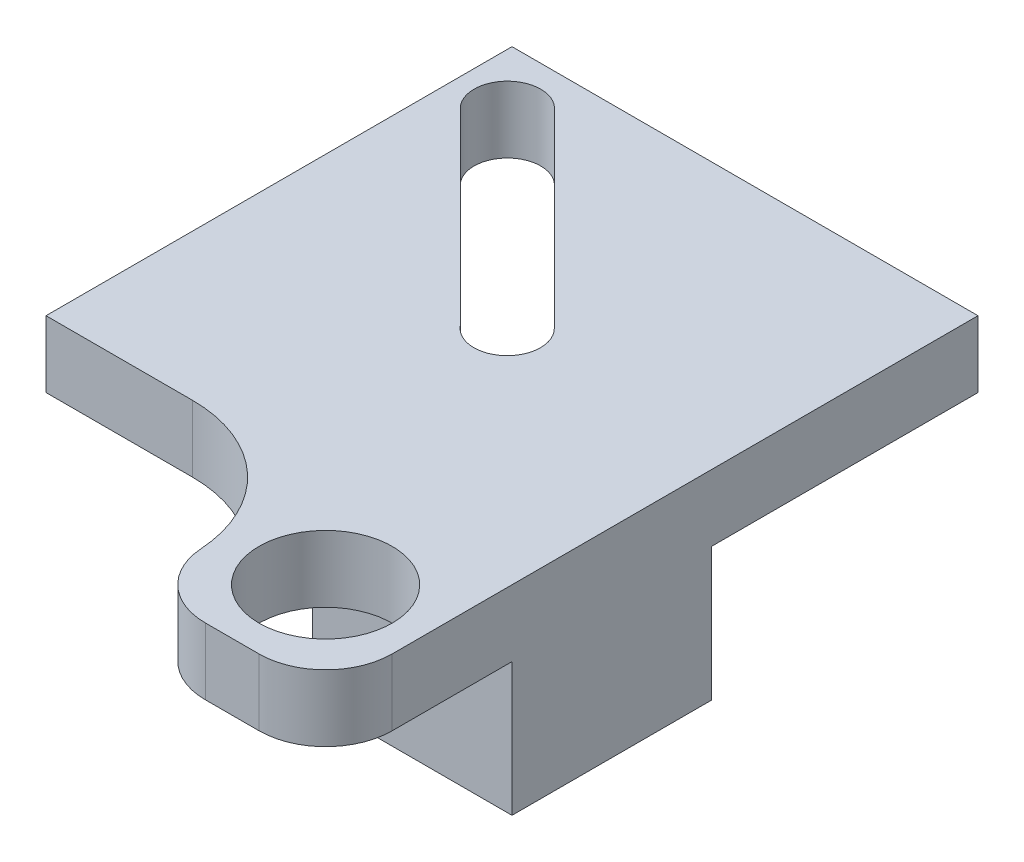
ISO-10303-21;
HEADER;
FILE_DESCRIPTION(('STEP AP214'),'2;1');
FILE_NAME('part.step','',(''),(''),'','','');
FILE_SCHEMA(('AUTOMOTIVE_DESIGN { 1 0 10303 214 1 1 1 1 }'));
ENDSEC;
DATA;
#1=APPLICATION_CONTEXT('core data for automotive mechanical design processes');
#2=APPLICATION_PROTOCOL_DEFINITION('international standard','automotive_design',2000,#1);
#3=PRODUCT_CONTEXT('',#1,'mechanical');
#4=PRODUCT('Part','Part','',(#3));
#5=PRODUCT_RELATED_PRODUCT_CATEGORY('part','',(#4));
#6=PRODUCT_DEFINITION_FORMATION('','',#4);
#7=PRODUCT_DEFINITION_CONTEXT('part definition',#1,'design');
#8=PRODUCT_DEFINITION('design','',#6,#7);
#9=PRODUCT_DEFINITION_SHAPE('','',#8);
#10=(LENGTH_UNIT() NAMED_UNIT(*) SI_UNIT(.MILLI.,.METRE.));
#11=(NAMED_UNIT(*) PLANE_ANGLE_UNIT() SI_UNIT($,.RADIAN.));
#12=(NAMED_UNIT(*) SI_UNIT($,.STERADIAN.) SOLID_ANGLE_UNIT());
#13=UNCERTAINTY_MEASURE_WITH_UNIT(LENGTH_MEASURE(1.E-05),#10,'distance_accuracy_value','');
#14=(GEOMETRIC_REPRESENTATION_CONTEXT(3) GLOBAL_UNCERTAINTY_ASSIGNED_CONTEXT((#13)) GLOBAL_UNIT_ASSIGNED_CONTEXT((#10,
#11,#12)) REPRESENTATION_CONTEXT('',''));
#15=CARTESIAN_POINT('',(0.,0.,0.));
#16=DIRECTION('',(0.,0.,1.));
#17=DIRECTION('',(1.,0.,0.));
#18=AXIS2_PLACEMENT_3D('',#15,#16,#17);
#19=CARTESIAN_POINT('',(21.,5.,0.));
#20=DIRECTION('',(0.,0.,-1.));
#21=DIRECTION('',(-1.,0.,0.));
#22=AXIS2_PLACEMENT_3D('',#19,#20,#21);
#23=PLANE('',#22);
#24=DIRECTION('',(-1.,0.,0.));
#25=VECTOR('',#24,1.);
#26=CARTESIAN_POINT('',(35.,0.,0.));
#27=LINE('',#26,#25);
#28=CARTESIAN_POINT('',(35.,0.,0.));
#29=VERTEX_POINT('',#28);
#30=CARTESIAN_POINT('',(20.,0.,0.));
#31=VERTEX_POINT('',#30);
#32=EDGE_CURVE('E183',#29,#31,#27,.T.);
#33=ORIENTED_EDGE('',*,*,#32,.T.);
#34=DIRECTION('',(0.,1.,0.));
#35=VECTOR('',#34,1.);
#36=CARTESIAN_POINT('',(20.,-10.,0.));
#37=LINE('',#36,#35);
#38=CARTESIAN_POINT('',(20.,-10.,0.));
#39=VERTEX_POINT('',#38);
#40=EDGE_CURVE('E165',#39,#31,#37,.T.);
#41=ORIENTED_EDGE('',*,*,#40,.F.);
#42=DIRECTION('',(-1.,0.,0.));
#43=VECTOR('',#42,1.);
#44=CARTESIAN_POINT('',(35.,-10.,0.));
#45=LINE('',#44,#43);
#46=CARTESIAN_POINT('',(35.,-10.,0.));
#47=VERTEX_POINT('',#46);
#48=EDGE_CURVE('E171',#47,#39,#45,.T.);
#49=ORIENTED_EDGE('',*,*,#48,.F.);
#50=DIRECTION('',(0.,1.,0.));
#51=VECTOR('',#50,1.);
#52=CARTESIAN_POINT('',(35.,-10.,0.));
#53=LINE('',#52,#51);
#54=EDGE_CURVE('E319',#47,#29,#53,.T.);
#55=ORIENTED_EDGE('',*,*,#54,.T.);
#56=EDGE_LOOP('',(#33,#41,#49,#55));
#57=FACE_BOUND('',#56,.T.);
#58=ADVANCED_FACE('F33',(#57),#23,.F.);
#59=CARTESIAN_POINT('',(0.,0.,0.));
#60=DIRECTION('',(0.,-1.,0.));
#61=DIRECTION('',(0.,0.,-1.));
#62=AXIS2_PLACEMENT_3D('',#59,#60,#61);
#63=PLANE('',#62);
#64=DIRECTION('',(0.,0.,-1.));
#65=VECTOR('',#64,1.);
#66=CARTESIAN_POINT('',(35.,0.,-35.));
#67=LINE('',#66,#65);
#68=CARTESIAN_POINT('',(35.,0.,9.));
#69=VERTEX_POINT('',#68);
#70=EDGE_CURVE('E247',#69,#29,#67,.T.);
#71=ORIENTED_EDGE('',*,*,#70,.F.);
#72=CARTESIAN_POINT('',(30.,0.,9.));
#73=DIRECTION('',(0.,-1.,0.));
#74=DIRECTION('',(0.,0.,-1.));
#75=AXIS2_PLACEMENT_3D('',#72,#73,#74);
#76=CIRCLE('',#75,5.);
#77=CARTESIAN_POINT('',(30.,0.,14.));
#78=VERTEX_POINT('',#77);
#79=EDGE_CURVE('E271',#69,#78,#76,.T.);
#80=ORIENTED_EDGE('',*,*,#79,.T.);
#81=DIRECTION('',(1.,0.,0.));
#82=VECTOR('',#81,1.);
#83=CARTESIAN_POINT('',(35.,0.,14.));
#84=LINE('',#83,#82);
#85=CARTESIAN_POINT('',(25.9666295470958,0.,14.));
#86=VERTEX_POINT('',#85);
#87=EDGE_CURVE('E244',#86,#78,#84,.T.);
#88=ORIENTED_EDGE('',*,*,#87,.F.);
#89=CARTESIAN_POINT('',(25.9666295470958,0.,9.));
#90=DIRECTION('',(0.,-1.,0.));
#91=DIRECTION('',(0.,0.,-1.));
#92=AXIS2_PLACEMENT_3D('',#89,#90,#91);
#93=CIRCLE('',#92,5.);
#94=CARTESIAN_POINT('',(20.9777530313972,0.,9.33333333333333));
#95=VERTEX_POINT('',#94);
#96=EDGE_CURVE('E269',#86,#95,#93,.T.);
#97=ORIENTED_EDGE('',*,*,#96,.T.);
#98=CARTESIAN_POINT('',(11.,0.,10.));
#99=DIRECTION('',(0.,-1.,0.));
#100=DIRECTION('',(0.,0.,-1.));
#101=AXIS2_PLACEMENT_3D('',#98,#99,#100);
#102=CIRCLE('',#101,10.);
#103=CARTESIAN_POINT('',(11.,0.,0.));
#104=VERTEX_POINT('',#103);
#105=EDGE_CURVE('E262',#95,#104,#102,.F.);
#106=ORIENTED_EDGE('',*,*,#105,.T.);
#107=DIRECTION('',(1.,0.,0.));
#108=VECTOR('',#107,1.);
#109=CARTESIAN_POINT('',(21.,0.,0.));
#110=LINE('',#109,#108);
#111=EDGE_CURVE('E227',#104,#31,#110,.T.);
#112=ORIENTED_EDGE('',*,*,#111,.T.);
#113=ORIENTED_EDGE('',*,*,#32,.F.);
#114=EDGE_LOOP('',(#71,#80,#88,#97,#106,#112,#113));
#115=FACE_BOUND('',#114,.T.);
#116=CARTESIAN_POINT('',(28.,0.,7.));
#117=DIRECTION('',(0.,1.,0.));
#118=DIRECTION('',(0.,0.,1.));
#119=AXIS2_PLACEMENT_3D('',#116,#117,#118);
#120=CIRCLE('',#119,5.);
#121=CARTESIAN_POINT('',(28.,0.,12.));
#122=VERTEX_POINT('',#121);
#123=EDGE_CURVE('E185',#122,#122,#120,.T.);
#124=ORIENTED_EDGE('',*,*,#123,.T.);
#125=EDGE_LOOP('',(#124));
#126=FACE_BOUND('',#125,.T.);
#127=ADVANCED_FACE('F293',(#115,#126),#63,.T.);
#128=CARTESIAN_POINT('',(0.,5.,0.));
#129=DIRECTION('',(0.,-1.,0.));
#130=DIRECTION('',(0.,0.,-1.));
#131=AXIS2_PLACEMENT_3D('',#128,#129,#130);
#132=PLANE('',#131);
#133=DIRECTION('',(1.,0.,0.));
#134=VECTOR('',#133,1.);
#135=CARTESIAN_POINT('',(35.,5.,14.));
#136=LINE('',#135,#134);
#137=CARTESIAN_POINT('',(25.9666295470958,5.,14.));
#138=VERTEX_POINT('',#137);
#139=CARTESIAN_POINT('',(30.,5.,14.));
#140=VERTEX_POINT('',#139);
#141=EDGE_CURVE('E231',#138,#140,#136,.T.);
#142=ORIENTED_EDGE('',*,*,#141,.T.);
#143=CARTESIAN_POINT('',(30.,5.,9.));
#144=DIRECTION('',(0.,-1.,0.));
#145=DIRECTION('',(0.,0.,-1.));
#146=AXIS2_PLACEMENT_3D('',#143,#144,#145);
#147=CIRCLE('',#146,5.);
#148=CARTESIAN_POINT('',(35.,5.,9.));
#149=VERTEX_POINT('',#148);
#150=EDGE_CURVE('E41',#140,#149,#147,.F.);
#151=ORIENTED_EDGE('',*,*,#150,.T.);
#152=DIRECTION('',(0.,0.,-1.));
#153=VECTOR('',#152,1.);
#154=CARTESIAN_POINT('',(35.,5.,0.));
#155=LINE('',#154,#153);
#156=CARTESIAN_POINT('',(35.,5.,-35.));
#157=VERTEX_POINT('',#156);
#158=EDGE_CURVE('E234',#149,#157,#155,.T.);
#159=ORIENTED_EDGE('',*,*,#158,.T.);
#160=DIRECTION('',(-1.,0.,0.));
#161=VECTOR('',#160,1.);
#162=CARTESIAN_POINT('',(35.,5.,-35.));
#163=LINE('',#162,#161);
#164=CARTESIAN_POINT('',(0.,5.,-35.));
#165=VERTEX_POINT('',#164);
#166=EDGE_CURVE('E236',#157,#165,#163,.T.);
#167=ORIENTED_EDGE('',*,*,#166,.T.);
#168=DIRECTION('',(0.,0.,1.));
#169=VECTOR('',#168,1.);
#170=CARTESIAN_POINT('',(0.,5.,0.));
#171=LINE('',#170,#169);
#172=CARTESIAN_POINT('',(0.,5.,0.));
#173=VERTEX_POINT('',#172);
#174=EDGE_CURVE('E238',#165,#173,#171,.T.);
#175=ORIENTED_EDGE('',*,*,#174,.T.);
#176=DIRECTION('',(1.,0.,0.));
#177=VECTOR('',#176,1.);
#178=CARTESIAN_POINT('',(21.,5.,0.));
#179=LINE('',#178,#177);
#180=CARTESIAN_POINT('',(11.,5.,0.));
#181=VERTEX_POINT('',#180);
#182=EDGE_CURVE('E228',#173,#181,#179,.T.);
#183=ORIENTED_EDGE('',*,*,#182,.T.);
#184=CARTESIAN_POINT('',(11.,5.,10.));
#185=DIRECTION('',(0.,-1.,0.));
#186=DIRECTION('',(0.,0.,-1.));
#187=AXIS2_PLACEMENT_3D('',#184,#185,#186);
#188=CIRCLE('',#187,10.);
#189=CARTESIAN_POINT('',(20.9777530313972,5.,9.33333333333333));
#190=VERTEX_POINT('',#189);
#191=EDGE_CURVE('E264',#181,#190,#188,.T.);
#192=ORIENTED_EDGE('',*,*,#191,.T.);
#193=CARTESIAN_POINT('',(25.9666295470958,5.,9.));
#194=DIRECTION('',(0.,-1.,0.));
#195=DIRECTION('',(0.,0.,-1.));
#196=AXIS2_PLACEMENT_3D('',#193,#194,#195);
#197=CIRCLE('',#196,5.);
#198=EDGE_CURVE('E277',#190,#138,#197,.F.);
#199=ORIENTED_EDGE('',*,*,#198,.T.);
#200=EDGE_LOOP('',(#142,#151,#159,#167,#175,#183,#192,#199));
#201=FACE_BOUND('',#200,.T.);
#202=CARTESIAN_POINT('',(3.8408297161038,5.,-30.8136023073707));
#203=DIRECTION('',(0.,1.,0.));
#204=DIRECTION('',(0.,0.,1.));
#205=AXIS2_PLACEMENT_3D('',#202,#203,#204);
#206=CIRCLE('',#205,2.50307538743037);
#207=CARTESIAN_POINT('',(5.77728434988736,5.,-32.3996445030446));
#208=VERTEX_POINT('',#207);
#209=CARTESIAN_POINT('',(2.07088813583075,5.,-29.0436607270975));
#210=VERTEX_POINT('',#209);
#211=EDGE_CURVE('E197',#208,#210,#206,.T.);
#212=ORIENTED_EDGE('',*,*,#211,.F.);
#213=DIRECTION('',(-0.707106781186551,0.,-0.707106781186543));
#214=VECTOR('',#213,1.);
#215=CARTESIAN_POINT('',(5.77728434988736,5.,-32.3996445030446));
#216=LINE('',#215,#214);
#217=CARTESIAN_POINT('',(19.9194199736268,5.,-18.2575088793053));
#218=VERTEX_POINT('',#217);
#219=EDGE_CURVE('E205',#218,#208,#216,.T.);
#220=ORIENTED_EDGE('',*,*,#219,.F.);
#221=CARTESIAN_POINT('',(18.1494783933532,5.,-16.4875672990317));
#222=DIRECTION('',(0.,1.,0.));
#223=DIRECTION('',(0.,0.,1.));
#224=AXIS2_PLACEMENT_3D('',#221,#222,#223);
#225=CIRCLE('',#224,2.50307538743099);
#226=CARTESIAN_POINT('',(16.2130237595617,5.,-14.9015251033665));
#227=VERTEX_POINT('',#226);
#228=EDGE_CURVE('E202',#227,#218,#225,.T.);
#229=ORIENTED_EDGE('',*,*,#228,.F.);
#230=DIRECTION('',(0.707106781186549,0.,0.707106781186546));
#231=VECTOR('',#230,1.);
#232=CARTESIAN_POINT('',(16.2130237595617,5.,-14.9015251033666));
#233=LINE('',#232,#231);
#234=EDGE_CURVE('E199',#210,#227,#233,.T.);
#235=ORIENTED_EDGE('',*,*,#234,.F.);
#236=EDGE_LOOP('',(#212,#220,#229,#235));
#237=FACE_BOUND('',#236,.T.);
#238=CARTESIAN_POINT('',(28.,5.,7.));
#239=DIRECTION('',(0.,1.,0.));
#240=DIRECTION('',(0.,0.,1.));
#241=AXIS2_PLACEMENT_3D('',#238,#239,#240);
#242=CIRCLE('',#241,5.);
#243=CARTESIAN_POINT('',(28.,5.,12.));
#244=VERTEX_POINT('',#243);
#245=EDGE_CURVE('E188',#244,#244,#242,.T.);
#246=ORIENTED_EDGE('',*,*,#245,.F.);
#247=EDGE_LOOP('',(#246));
#248=FACE_BOUND('',#247,.T.);
#249=ADVANCED_FACE('F281',(#201,#237,#248),#132,.F.);
#250=DIRECTION('',(1.,0.,0.));
#251=VECTOR('',#250,1.);
#252=CARTESIAN_POINT('',(35.,0.,-15.));
#253=LINE('',#252,#251);
#254=CARTESIAN_POINT('',(30.,0.,-15.));
#255=VERTEX_POINT('',#254);
#256=CARTESIAN_POINT('',(35.,0.,-15.));
#257=VERTEX_POINT('',#256);
#258=EDGE_CURVE('E180',#255,#257,#253,.T.);
#259=ORIENTED_EDGE('',*,*,#258,.F.);
#260=DIRECTION('',(0.,0.,-1.));
#261=VECTOR('',#260,1.);
#262=CARTESIAN_POINT('',(30.,0.,-5.));
#263=LINE('',#262,#261);
#264=CARTESIAN_POINT('',(30.,0.,-5.));
#265=VERTEX_POINT('',#264);
#266=EDGE_CURVE('E338',#265,#255,#263,.T.);
#267=ORIENTED_EDGE('',*,*,#266,.F.);
#268=DIRECTION('',(1.,0.,0.));
#269=VECTOR('',#268,1.);
#270=CARTESIAN_POINT('',(30.,0.,-5.));
#271=LINE('',#270,#269);
#272=CARTESIAN_POINT('',(20.,0.,-5.));
#273=VERTEX_POINT('',#272);
#274=EDGE_CURVE('E343',#273,#265,#271,.T.);
#275=ORIENTED_EDGE('',*,*,#274,.F.);
#276=DIRECTION('',(0.,0.,-1.));
#277=VECTOR('',#276,1.);
#278=CARTESIAN_POINT('',(20.,0.,0.));
#279=LINE('',#278,#277);
#280=EDGE_CURVE('E317',#31,#273,#279,.T.);
#281=ORIENTED_EDGE('',*,*,#280,.F.);
#282=ORIENTED_EDGE('',*,*,#111,.F.);
#283=CARTESIAN_POINT('',(0.,0.,0.));
#284=VERTEX_POINT('',#283);
#285=EDGE_CURVE('E241',#284,#104,#110,.T.);
#286=ORIENTED_EDGE('',*,*,#285,.F.);
#287=DIRECTION('',(0.,0.,1.));
#288=VECTOR('',#287,1.);
#289=CARTESIAN_POINT('',(0.,0.,0.));
#290=LINE('',#289,#288);
#291=CARTESIAN_POINT('',(0.,0.,-35.));
#292=VERTEX_POINT('',#291);
#293=EDGE_CURVE('E232',#292,#284,#290,.T.);
#294=ORIENTED_EDGE('',*,*,#293,.F.);
#295=DIRECTION('',(-1.,0.,0.));
#296=VECTOR('',#295,1.);
#297=CARTESIAN_POINT('',(35.,0.,-35.));
#298=LINE('',#297,#296);
#299=CARTESIAN_POINT('',(35.,0.,-35.));
#300=VERTEX_POINT('',#299);
#301=EDGE_CURVE('E249',#300,#292,#298,.T.);
#302=ORIENTED_EDGE('',*,*,#301,.F.);
#303=EDGE_CURVE('E246',#257,#300,#67,.T.);
#304=ORIENTED_EDGE('',*,*,#303,.F.);
#305=EDGE_LOOP('',(#259,#267,#275,#281,#282,#286,#294,#302,#304));
#306=FACE_BOUND('',#305,.T.);
#307=DIRECTION('',(-0.707106781186551,0.,-0.707106781186543));
#308=VECTOR('',#307,1.);
#309=CARTESIAN_POINT('',(5.77728434988736,0.,-32.3996445030446));
#310=LINE('',#309,#308);
#311=CARTESIAN_POINT('',(19.9194199736268,0.,-18.2575088793053));
#312=VERTEX_POINT('',#311);
#313=CARTESIAN_POINT('',(5.77728434988736,0.,-32.3996445030446));
#314=VERTEX_POINT('',#313);
#315=EDGE_CURVE('E200',#312,#314,#310,.T.);
#316=ORIENTED_EDGE('',*,*,#315,.T.);
#317=CARTESIAN_POINT('',(3.8408297161038,0.,-30.8136023073707));
#318=DIRECTION('',(0.,1.,0.));
#319=DIRECTION('',(0.,0.,1.));
#320=AXIS2_PLACEMENT_3D('',#317,#318,#319);
#321=CIRCLE('',#320,2.50307538743037);
#322=CARTESIAN_POINT('',(2.07088813583075,0.,-29.0436607270975));
#323=VERTEX_POINT('',#322);
#324=EDGE_CURVE('E195',#314,#323,#321,.T.);
#325=ORIENTED_EDGE('',*,*,#324,.T.);
#326=DIRECTION('',(0.707106781186549,0.,0.707106781186546));
#327=VECTOR('',#326,1.);
#328=CARTESIAN_POINT('',(16.2130237595617,0.,-14.9015251033666));
#329=LINE('',#328,#327);
#330=CARTESIAN_POINT('',(16.2130237595617,0.,-14.9015251033665));
#331=VERTEX_POINT('',#330);
#332=EDGE_CURVE('E210',#323,#331,#329,.T.);
#333=ORIENTED_EDGE('',*,*,#332,.T.);
#334=CARTESIAN_POINT('',(18.1494783933532,0.,-16.4875672990317));
#335=DIRECTION('',(0.,1.,0.));
#336=DIRECTION('',(0.,0.,1.));
#337=AXIS2_PLACEMENT_3D('',#334,#335,#336);
#338=CIRCLE('',#337,2.50307538743099);
#339=EDGE_CURVE('E213',#331,#312,#338,.T.);
#340=ORIENTED_EDGE('',*,*,#339,.T.);
#341=EDGE_LOOP('',(#316,#325,#333,#340));
#342=FACE_BOUND('',#341,.T.);
#343=ADVANCED_FACE('F313',(#306,#342),#63,.T.);
#344=ORIENTED_EDGE('',*,*,#285,.T.);
#345=DIRECTION('',(0.,-1.,0.));
#346=VECTOR('',#345,1.);
#347=CARTESIAN_POINT('',(11.,5.,0.));
#348=LINE('',#347,#346);
#349=EDGE_CURVE('E260',#104,#181,#348,.F.);
#350=ORIENTED_EDGE('',*,*,#349,.T.);
#351=ORIENTED_EDGE('',*,*,#182,.F.);
#352=DIRECTION('',(0.,-1.,0.));
#353=VECTOR('',#352,1.);
#354=CARTESIAN_POINT('',(0.,5.,0.));
#355=LINE('',#354,#353);
#356=EDGE_CURVE('E240',#173,#284,#355,.T.);
#357=ORIENTED_EDGE('',*,*,#356,.T.);
#358=EDGE_LOOP('',(#344,#350,#351,#357));
#359=FACE_BOUND('',#358,.T.);
#360=ADVANCED_FACE('F304',(#359),#23,.F.);
#361=CARTESIAN_POINT('',(35.,5.,14.));
#362=DIRECTION('',(0.,0.,-1.));
#363=DIRECTION('',(-1.,0.,0.));
#364=AXIS2_PLACEMENT_3D('',#361,#362,#363);
#365=PLANE('',#364);
#366=ORIENTED_EDGE('',*,*,#87,.T.);
#367=DIRECTION('',(0.,-1.,0.));
#368=VECTOR('',#367,1.);
#369=CARTESIAN_POINT('',(30.,5.,14.));
#370=LINE('',#369,#368);
#371=EDGE_CURVE('E54',#78,#140,#370,.F.);
#372=ORIENTED_EDGE('',*,*,#371,.T.);
#373=ORIENTED_EDGE('',*,*,#141,.F.);
#374=DIRECTION('',(0.,1.,0.));
#375=VECTOR('',#374,1.);
#376=CARTESIAN_POINT('',(25.9666295470958,5.,14.));
#377=LINE('',#376,#375);
#378=EDGE_CURVE('E273',#138,#86,#377,.F.);
#379=ORIENTED_EDGE('',*,*,#378,.T.);
#380=EDGE_LOOP('',(#366,#372,#373,#379));
#381=FACE_BOUND('',#380,.T.);
#382=ADVANCED_FACE('F295',(#381),#365,.F.);
#383=CARTESIAN_POINT('',(35.,5.,-35.));
#384=DIRECTION('',(-1.,0.,0.));
#385=DIRECTION('',(0.,0.,1.));
#386=AXIS2_PLACEMENT_3D('',#383,#384,#385);
#387=PLANE('',#386);
#388=ORIENTED_EDGE('',*,*,#158,.F.);
#389=DIRECTION('',(0.,-1.,0.));
#390=VECTOR('',#389,1.);
#391=CARTESIAN_POINT('',(35.,5.,9.));
#392=LINE('',#391,#390);
#393=EDGE_CURVE('E266',#149,#69,#392,.T.);
#394=ORIENTED_EDGE('',*,*,#393,.T.);
#395=ORIENTED_EDGE('',*,*,#70,.T.);
#396=ORIENTED_EDGE('',*,*,#54,.F.);
#397=DIRECTION('',(0.,0.,1.));
#398=VECTOR('',#397,1.);
#399=CARTESIAN_POINT('',(35.,-10.,-15.));
#400=LINE('',#399,#398);
#401=CARTESIAN_POINT('',(35.,-10.,-15.));
#402=VERTEX_POINT('',#401);
#403=EDGE_CURVE('E176',#402,#47,#400,.T.);
#404=ORIENTED_EDGE('',*,*,#403,.F.);
#405=DIRECTION('',(0.,1.,0.));
#406=VECTOR('',#405,1.);
#407=CARTESIAN_POINT('',(35.,-10.,-15.));
#408=LINE('',#407,#406);
#409=EDGE_CURVE('E320',#402,#257,#408,.T.);
#410=ORIENTED_EDGE('',*,*,#409,.T.);
#411=ORIENTED_EDGE('',*,*,#303,.T.);
#412=DIRECTION('',(0.,-1.,0.));
#413=VECTOR('',#412,1.);
#414=CARTESIAN_POINT('',(35.,5.,-35.));
#415=LINE('',#414,#413);
#416=EDGE_CURVE('E257',#157,#300,#415,.T.);
#417=ORIENTED_EDGE('',*,*,#416,.F.);
#418=EDGE_LOOP('',(#388,#394,#395,#396,#404,#410,#411,#417));
#419=FACE_BOUND('',#418,.T.);
#420=ADVANCED_FACE('F287',(#419),#387,.F.);
#421=CARTESIAN_POINT('',(35.,5.,-35.));
#422=DIRECTION('',(0.,0.,1.));
#423=DIRECTION('',(1.,0.,0.));
#424=AXIS2_PLACEMENT_3D('',#421,#422,#423);
#425=PLANE('',#424);
#426=ORIENTED_EDGE('',*,*,#301,.T.);
#427=DIRECTION('',(0.,-1.,0.));
#428=VECTOR('',#427,1.);
#429=CARTESIAN_POINT('',(0.,5.,-35.));
#430=LINE('',#429,#428);
#431=EDGE_CURVE('E254',#165,#292,#430,.T.);
#432=ORIENTED_EDGE('',*,*,#431,.F.);
#433=ORIENTED_EDGE('',*,*,#166,.F.);
#434=ORIENTED_EDGE('',*,*,#416,.T.);
#435=EDGE_LOOP('',(#426,#432,#433,#434));
#436=FACE_BOUND('',#435,.T.);
#437=ADVANCED_FACE('F355',(#436),#425,.F.);
#438=CARTESIAN_POINT('',(0.,5.,0.));
#439=DIRECTION('',(1.,0.,0.));
#440=DIRECTION('',(0.,0.,-1.));
#441=AXIS2_PLACEMENT_3D('',#438,#439,#440);
#442=PLANE('',#441);
#443=ORIENTED_EDGE('',*,*,#293,.T.);
#444=ORIENTED_EDGE('',*,*,#356,.F.);
#445=ORIENTED_EDGE('',*,*,#174,.F.);
#446=ORIENTED_EDGE('',*,*,#431,.T.);
#447=EDGE_LOOP('',(#443,#444,#445,#446));
#448=FACE_BOUND('',#447,.T.);
#449=ADVANCED_FACE('F310',(#448),#442,.F.);
#450=CARTESIAN_POINT('',(3.8408297161038,5.,-30.8136023073707));
#451=DIRECTION('',(0.,-1.,0.));
#452=DIRECTION('',(0.,0.,-1.));
#453=AXIS2_PLACEMENT_3D('',#450,#451,#452);
#454=CYLINDRICAL_SURFACE('',#453,2.50307538743037);
#455=ORIENTED_EDGE('',*,*,#324,.F.);
#456=DIRECTION('',(0.,-1.,0.));
#457=VECTOR('',#456,1.);
#458=CARTESIAN_POINT('',(5.77728434988736,5.,-32.3996445030446));
#459=LINE('',#458,#457);
#460=EDGE_CURVE('E207',#208,#314,#459,.T.);
#461=ORIENTED_EDGE('',*,*,#460,.F.);
#462=ORIENTED_EDGE('',*,*,#211,.T.);
#463=DIRECTION('',(0.,-1.,0.));
#464=VECTOR('',#463,1.);
#465=CARTESIAN_POINT('',(2.07088813583075,5.,-29.0436607270975));
#466=LINE('',#465,#464);
#467=EDGE_CURVE('E224',#210,#323,#466,.T.);
#468=ORIENTED_EDGE('',*,*,#467,.T.);
#469=EDGE_LOOP('',(#455,#461,#462,#468));
#470=FACE_BOUND('',#469,.T.);
#471=ADVANCED_FACE('F362',(#470),#454,.F.);
#472=CARTESIAN_POINT('',(16.2130237595617,5.,-14.9015251033666));
#473=DIRECTION('',(0.707106781186546,0.,-0.707106781186549));
#474=DIRECTION('',(-0.707106781186549,0.,-0.707106781186546));
#475=AXIS2_PLACEMENT_3D('',#472,#473,#474);
#476=PLANE('',#475);
#477=ORIENTED_EDGE('',*,*,#332,.F.);
#478=ORIENTED_EDGE('',*,*,#467,.F.);
#479=ORIENTED_EDGE('',*,*,#234,.T.);
#480=DIRECTION('',(0.,-1.,0.));
#481=VECTOR('',#480,1.);
#482=CARTESIAN_POINT('',(16.2130237595617,5.,-14.9015251033665));
#483=LINE('',#482,#481);
#484=EDGE_CURVE('E222',#227,#331,#483,.T.);
#485=ORIENTED_EDGE('',*,*,#484,.T.);
#486=EDGE_LOOP('',(#477,#478,#479,#485));
#487=FACE_BOUND('',#486,.T.);
#488=ADVANCED_FACE('F385',(#487),#476,.T.);
#489=CARTESIAN_POINT('',(18.1494783933532,5.,-16.4875672990317));
#490=DIRECTION('',(0.,-1.,0.));
#491=DIRECTION('',(0.,0.,-1.));
#492=AXIS2_PLACEMENT_3D('',#489,#490,#491);
#493=CYLINDRICAL_SURFACE('',#492,2.50307538743099);
#494=ORIENTED_EDGE('',*,*,#339,.F.);
#495=ORIENTED_EDGE('',*,*,#484,.F.);
#496=ORIENTED_EDGE('',*,*,#228,.T.);
#497=DIRECTION('',(0.,-1.,0.));
#498=VECTOR('',#497,1.);
#499=CARTESIAN_POINT('',(19.9194199736268,5.,-18.2575088793053));
#500=LINE('',#499,#498);
#501=EDGE_CURVE('E220',#218,#312,#500,.T.);
#502=ORIENTED_EDGE('',*,*,#501,.T.);
#503=EDGE_LOOP('',(#494,#495,#496,#502));
#504=FACE_BOUND('',#503,.T.);
#505=ADVANCED_FACE('F389',(#504),#493,.F.);
#506=CARTESIAN_POINT('',(5.77728434988736,5.,-32.3996445030446));
#507=DIRECTION('',(-0.707106781186544,0.,0.707106781186552));
#508=DIRECTION('',(0.707106781186552,0.,0.707106781186544));
#509=AXIS2_PLACEMENT_3D('',#506,#507,#508);
#510=PLANE('',#509);
#511=ORIENTED_EDGE('',*,*,#315,.F.);
#512=ORIENTED_EDGE('',*,*,#501,.F.);
#513=ORIENTED_EDGE('',*,*,#219,.T.);
#514=ORIENTED_EDGE('',*,*,#460,.T.);
#515=EDGE_LOOP('',(#511,#512,#513,#514));
#516=FACE_BOUND('',#515,.T.);
#517=ADVANCED_FACE('F393',(#516),#510,.T.);
#518=CARTESIAN_POINT('',(28.,5.,7.));
#519=DIRECTION('',(0.,-1.,0.));
#520=DIRECTION('',(0.,0.,-1.));
#521=AXIS2_PLACEMENT_3D('',#518,#519,#520);
#522=CYLINDRICAL_SURFACE('',#521,5.);
#523=ORIENTED_EDGE('',*,*,#245,.T.);
#524=EDGE_LOOP('',(#523));
#525=FACE_BOUND('',#524,.T.);
#526=ORIENTED_EDGE('',*,*,#123,.F.);
#527=EDGE_LOOP('',(#526));
#528=FACE_BOUND('',#527,.T.);
#529=ADVANCED_FACE('F397',(#525,#528),#522,.F.);
#530=CARTESIAN_POINT('',(20.,-10.,0.));
#531=DIRECTION('',(1.,0.,0.));
#532=DIRECTION('',(0.,0.,-1.));
#533=AXIS2_PLACEMENT_3D('',#530,#531,#532);
#534=PLANE('',#533);
#535=ORIENTED_EDGE('',*,*,#280,.T.);
#536=DIRECTION('',(0.,1.,0.));
#537=VECTOR('',#536,1.);
#538=CARTESIAN_POINT('',(20.,-10.,-5.));
#539=LINE('',#538,#537);
#540=CARTESIAN_POINT('',(20.,-10.,-5.));
#541=VERTEX_POINT('',#540);
#542=EDGE_CURVE('E167',#541,#273,#539,.T.);
#543=ORIENTED_EDGE('',*,*,#542,.F.);
#544=DIRECTION('',(0.,0.,-1.));
#545=VECTOR('',#544,1.);
#546=CARTESIAN_POINT('',(20.,-10.,0.));
#547=LINE('',#546,#545);
#548=EDGE_CURVE('E160',#39,#541,#547,.T.);
#549=ORIENTED_EDGE('',*,*,#548,.F.);
#550=ORIENTED_EDGE('',*,*,#40,.T.);
#551=EDGE_LOOP('',(#535,#543,#549,#550));
#552=FACE_BOUND('',#551,.T.);
#553=ADVANCED_FACE('F163',(#552),#534,.F.);
#554=CARTESIAN_POINT('',(30.,-10.,-5.));
#555=DIRECTION('',(0.,0.,1.));
#556=DIRECTION('',(1.,0.,0.));
#557=AXIS2_PLACEMENT_3D('',#554,#555,#556);
#558=PLANE('',#557);
#559=ORIENTED_EDGE('',*,*,#274,.T.);
#560=DIRECTION('',(0.,1.,0.));
#561=VECTOR('',#560,1.);
#562=CARTESIAN_POINT('',(30.,-10.,-5.));
#563=LINE('',#562,#561);
#564=CARTESIAN_POINT('',(30.,-10.,-5.));
#565=VERTEX_POINT('',#564);
#566=EDGE_CURVE('E190',#565,#265,#563,.T.);
#567=ORIENTED_EDGE('',*,*,#566,.F.);
#568=DIRECTION('',(1.,0.,0.));
#569=VECTOR('',#568,1.);
#570=CARTESIAN_POINT('',(30.,-10.,-5.));
#571=LINE('',#570,#569);
#572=EDGE_CURVE('E170',#541,#565,#571,.T.);
#573=ORIENTED_EDGE('',*,*,#572,.F.);
#574=ORIENTED_EDGE('',*,*,#542,.T.);
#575=EDGE_LOOP('',(#559,#567,#573,#574));
#576=FACE_BOUND('',#575,.T.);
#577=ADVANCED_FACE('F342',(#576),#558,.F.);
#578=CARTESIAN_POINT('',(30.,-10.,-5.));
#579=DIRECTION('',(1.,0.,0.));
#580=DIRECTION('',(0.,0.,-1.));
#581=AXIS2_PLACEMENT_3D('',#578,#579,#580);
#582=PLANE('',#581);
#583=ORIENTED_EDGE('',*,*,#266,.T.);
#584=DIRECTION('',(0.,1.,0.));
#585=VECTOR('',#584,1.);
#586=CARTESIAN_POINT('',(30.,-10.,-15.));
#587=LINE('',#586,#585);
#588=CARTESIAN_POINT('',(30.,-10.,-15.));
#589=VERTEX_POINT('',#588);
#590=EDGE_CURVE('E323',#589,#255,#587,.T.);
#591=ORIENTED_EDGE('',*,*,#590,.F.);
#592=DIRECTION('',(0.,0.,-1.));
#593=VECTOR('',#592,1.);
#594=CARTESIAN_POINT('',(30.,-10.,-5.));
#595=LINE('',#594,#593);
#596=EDGE_CURVE('E339',#565,#589,#595,.T.);
#597=ORIENTED_EDGE('',*,*,#596,.F.);
#598=ORIENTED_EDGE('',*,*,#566,.T.);
#599=EDGE_LOOP('',(#583,#591,#597,#598));
#600=FACE_BOUND('',#599,.T.);
#601=ADVANCED_FACE('F336',(#600),#582,.F.);
#602=CARTESIAN_POINT('',(35.,-10.,-15.));
#603=DIRECTION('',(0.,0.,1.));
#604=DIRECTION('',(1.,0.,0.));
#605=AXIS2_PLACEMENT_3D('',#602,#603,#604);
#606=PLANE('',#605);
#607=ORIENTED_EDGE('',*,*,#258,.T.);
#608=ORIENTED_EDGE('',*,*,#409,.F.);
#609=DIRECTION('',(1.,0.,0.));
#610=VECTOR('',#609,1.);
#611=CARTESIAN_POINT('',(35.,-10.,-15.));
#612=LINE('',#611,#610);
#613=EDGE_CURVE('E325',#589,#402,#612,.T.);
#614=ORIENTED_EDGE('',*,*,#613,.F.);
#615=ORIENTED_EDGE('',*,*,#590,.T.);
#616=EDGE_LOOP('',(#607,#608,#614,#615));
#617=FACE_BOUND('',#616,.T.);
#618=ADVANCED_FACE('F353',(#617),#606,.F.);
#619=CARTESIAN_POINT('',(0.,-10.,0.));
#620=DIRECTION('',(0.,-1.,0.));
#621=DIRECTION('',(0.,0.,-1.));
#622=AXIS2_PLACEMENT_3D('',#619,#620,#621);
#623=PLANE('',#622);
#624=ORIENTED_EDGE('',*,*,#48,.T.);
#625=ORIENTED_EDGE('',*,*,#548,.T.);
#626=ORIENTED_EDGE('',*,*,#572,.T.);
#627=ORIENTED_EDGE('',*,*,#596,.T.);
#628=ORIENTED_EDGE('',*,*,#613,.T.);
#629=ORIENTED_EDGE('',*,*,#403,.T.);
#630=EDGE_LOOP('',(#624,#625,#626,#627,#628,#629));
#631=FACE_BOUND('',#630,.T.);
#632=ADVANCED_FACE('F174',(#631),#623,.T.);
#633=CARTESIAN_POINT('',(11.,5.,10.));
#634=DIRECTION('',(0.,1.,0.));
#635=DIRECTION('',(0.,0.,1.));
#636=AXIS2_PLACEMENT_3D('',#633,#634,#635);
#637=CYLINDRICAL_SURFACE('',#636,10.);
#638=ORIENTED_EDGE('',*,*,#105,.F.);
#639=DIRECTION('',(0.,1.,0.));
#640=VECTOR('',#639,1.);
#641=CARTESIAN_POINT('',(20.9777530313972,5.,9.33333333333333));
#642=LINE('',#641,#640);
#643=EDGE_CURVE('E11',#95,#190,#642,.T.);
#644=ORIENTED_EDGE('',*,*,#643,.T.);
#645=ORIENTED_EDGE('',*,*,#191,.F.);
#646=ORIENTED_EDGE('',*,*,#349,.F.);
#647=EDGE_LOOP('',(#638,#644,#645,#646));
#648=FACE_BOUND('',#647,.T.);
#649=ADVANCED_FACE('F301',(#648),#637,.F.);
#650=CARTESIAN_POINT('',(30.,5.,9.));
#651=DIRECTION('',(0.,-1.,0.));
#652=DIRECTION('',(0.,0.,-1.));
#653=AXIS2_PLACEMENT_3D('',#650,#651,#652);
#654=CYLINDRICAL_SURFACE('',#653,5.);
#655=ORIENTED_EDGE('',*,*,#150,.F.);
#656=ORIENTED_EDGE('',*,*,#371,.F.);
#657=ORIENTED_EDGE('',*,*,#79,.F.);
#658=ORIENTED_EDGE('',*,*,#393,.F.);
#659=EDGE_LOOP('',(#655,#656,#657,#658));
#660=FACE_BOUND('',#659,.T.);
#661=ADVANCED_FACE('F290',(#660),#654,.T.);
#662=CARTESIAN_POINT('',(25.9666295470958,5.,9.));
#663=DIRECTION('',(0.,1.,0.));
#664=DIRECTION('',(0.,0.,1.));
#665=AXIS2_PLACEMENT_3D('',#662,#663,#664);
#666=CYLINDRICAL_SURFACE('',#665,5.);
#667=ORIENTED_EDGE('',*,*,#198,.F.);
#668=ORIENTED_EDGE('',*,*,#643,.F.);
#669=ORIENTED_EDGE('',*,*,#96,.F.);
#670=ORIENTED_EDGE('',*,*,#378,.F.);
#671=EDGE_LOOP('',(#667,#668,#669,#670));
#672=FACE_BOUND('',#671,.T.);
#673=ADVANCED_FACE('F35',(#672),#666,.T.);
#674=CLOSED_SHELL('',(#58,#127,#249,#343,#360,#382,#420,#437,#449,#471,#488,#505,#517,#529,#553,
#577,#601,#618,#632,#649,#661,#673));
#675=MANIFOLD_SOLID_BREP('B2',#674);
#676=ADVANCED_BREP_SHAPE_REPRESENTATION('',(#18,#675),#14);
#677=SHAPE_DEFINITION_REPRESENTATION(#9,#676);
ENDSEC;
END-ISO-10303-21;
